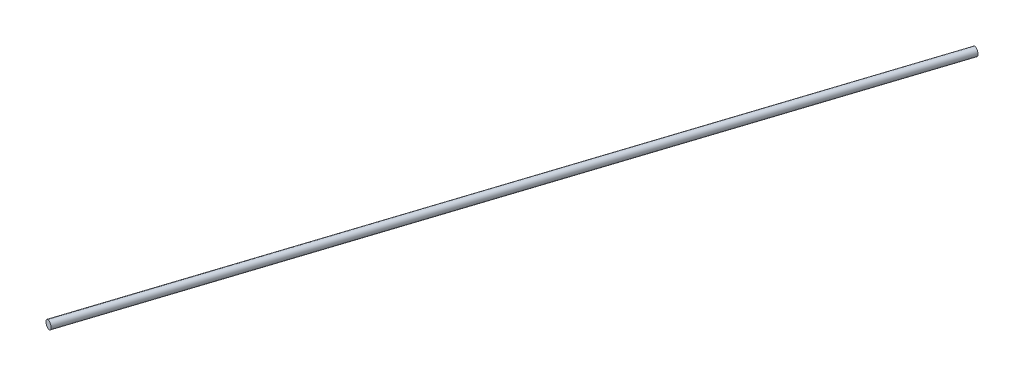
ISO-10303-21;
HEADER;
FILE_DESCRIPTION(('STEP AP214'),'2;1');
FILE_NAME('part.step','',(''),(''),'','','');
FILE_SCHEMA(('AUTOMOTIVE_DESIGN { 1 0 10303 214 1 1 1 1 }'));
ENDSEC;
DATA;
#1=APPLICATION_CONTEXT('core data for automotive mechanical design processes');
#2=APPLICATION_PROTOCOL_DEFINITION('international standard','automotive_design',2000,#1);
#3=PRODUCT_CONTEXT('',#1,'mechanical');
#4=PRODUCT('Part','Part','',(#3));
#5=PRODUCT_RELATED_PRODUCT_CATEGORY('part','',(#4));
#6=PRODUCT_DEFINITION_FORMATION('','',#4);
#7=PRODUCT_DEFINITION_CONTEXT('part definition',#1,'design');
#8=PRODUCT_DEFINITION('design','',#6,#7);
#9=PRODUCT_DEFINITION_SHAPE('','',#8);
#10=(LENGTH_UNIT() NAMED_UNIT(*) SI_UNIT(.MILLI.,.METRE.));
#11=(NAMED_UNIT(*) PLANE_ANGLE_UNIT() SI_UNIT($,.RADIAN.));
#12=(NAMED_UNIT(*) SI_UNIT($,.STERADIAN.) SOLID_ANGLE_UNIT());
#13=UNCERTAINTY_MEASURE_WITH_UNIT(LENGTH_MEASURE(1.E-05),#10,'distance_accuracy_value','');
#14=(GEOMETRIC_REPRESENTATION_CONTEXT(3) GLOBAL_UNCERTAINTY_ASSIGNED_CONTEXT((#13)) GLOBAL_UNIT_ASSIGNED_CONTEXT((#10,
#11,#12)) REPRESENTATION_CONTEXT('',''));
#15=CARTESIAN_POINT('',(0.,0.,0.));
#16=DIRECTION('',(0.,0.,1.));
#17=DIRECTION('',(1.,0.,0.));
#18=AXIS2_PLACEMENT_3D('',#15,#16,#17);
#19=CARTESIAN_POINT('',(205.3487261301,-850.,178.63891910329));
#20=DIRECTION('',(0.30818692343611,0.,-0.95132582232534));
#21=DIRECTION('',(0.,-1.,0.));
#22=AXIS2_PLACEMENT_3D('',#19,#20,#21);
#23=PLANE('',#22);
#24=CARTESIAN_POINT('',(205.3487261301,-850.,178.63891910329));
#25=DIRECTION('',(0.30818692343611,0.,-0.95132582232534));
#26=DIRECTION('',(-0.95132582232534,0.,-0.30818692343611));
#27=AXIS2_PLACEMENT_3D('',#24,#25,#26);
#28=CIRCLE('',#27,1.);
#29=CARTESIAN_POINT('',(204.39740030778,-850.,178.33073217986));
#30=VERTEX_POINT('',#29);
#31=EDGE_CURVE('E10',#30,#30,#28,.T.);
#32=ORIENTED_EDGE('',*,*,#31,.F.);
#33=EDGE_LOOP('',(#32));
#34=FACE_BOUND('',#33,.T.);
#35=ADVANCED_FACE('F15',(#34),#23,.F.);
#36=CARTESIAN_POINT('',(263.21972846436,-850.,0.));
#37=DIRECTION('',(0.30818692343611,0.,-0.95132582232534));
#38=DIRECTION('',(0.,-1.,0.));
#39=AXIS2_PLACEMENT_3D('',#36,#37,#38);
#40=PLANE('',#39);
#41=CARTESIAN_POINT('',(263.21972846436,-850.,0.));
#42=DIRECTION('',(0.30818692343611,0.,-0.95132582232534));
#43=DIRECTION('',(-0.95132582232534,0.,-0.30818692343611));
#44=AXIS2_PLACEMENT_3D('',#41,#42,#43);
#45=CIRCLE('',#44,1.);
#46=CARTESIAN_POINT('',(262.26840264203,-850.,-0.308186923436));
#47=VERTEX_POINT('',#46);
#48=EDGE_CURVE('E39',#47,#47,#45,.T.);
#49=ORIENTED_EDGE('',*,*,#48,.T.);
#50=EDGE_LOOP('',(#49));
#51=FACE_BOUND('',#50,.T.);
#52=ADVANCED_FACE('F42',(#51),#40,.T.);
#53=CARTESIAN_POINT('',(205.3487261301,-850.,178.63891910329));
#54=DIRECTION('',(0.30818692343611,0.,-0.95132582232534));
#55=DIRECTION('',(-0.95132582232534,0.,-0.30818692343611));
#56=AXIS2_PLACEMENT_3D('',#53,#54,#55);
#57=CYLINDRICAL_SURFACE('',#56,1.);
#58=ORIENTED_EDGE('',*,*,#48,.F.);
#59=DIRECTION('',(0.30818692343611,0.,-0.95132582232534));
#60=VECTOR('',#59,1.);
#61=CARTESIAN_POINT('',(204.39740030778,-850.,178.33073217986));
#62=LINE('',#61,#60);
#63=EDGE_CURVE('E18',#30,#47,#62,.T.);
#64=ORIENTED_EDGE('',*,*,#63,.F.);
#65=ORIENTED_EDGE('',*,*,#31,.T.);
#66=ORIENTED_EDGE('',*,*,#63,.T.);
#67=EDGE_LOOP('',(#58,#64,#65,#66));
#68=FACE_BOUND('',#67,.T.);
#69=ADVANCED_FACE('F38',(#68),#57,.T.);
#70=CLOSED_SHELL('',(#35,#52,#69));
#71=MANIFOLD_SOLID_BREP('B1',#70);
#72=ADVANCED_BREP_SHAPE_REPRESENTATION('',(#18,#71),#14);
#73=SHAPE_DEFINITION_REPRESENTATION(#9,#72);
ENDSEC;
END-ISO-10303-21;
